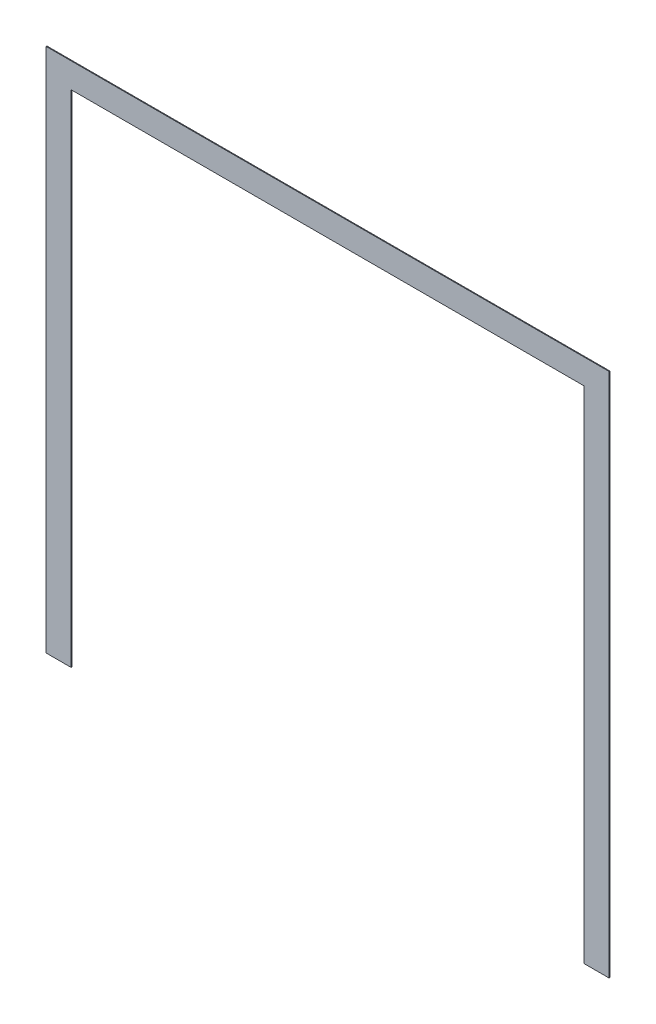
ISO-10303-21;
HEADER;
FILE_DESCRIPTION(('STEP AP214'),'2;1');
FILE_NAME('part.step','',(''),(''),'','','');
FILE_SCHEMA(('AUTOMOTIVE_DESIGN { 1 0 10303 214 1 1 1 1 }'));
ENDSEC;
DATA;
#1=APPLICATION_CONTEXT('core data for automotive mechanical design processes');
#2=APPLICATION_PROTOCOL_DEFINITION('international standard','automotive_design',2000,#1);
#3=PRODUCT_CONTEXT('',#1,'mechanical');
#4=PRODUCT('Part','Part','',(#3));
#5=PRODUCT_RELATED_PRODUCT_CATEGORY('part','',(#4));
#6=PRODUCT_DEFINITION_FORMATION('','',#4);
#7=PRODUCT_DEFINITION_CONTEXT('part definition',#1,'design');
#8=PRODUCT_DEFINITION('design','',#6,#7);
#9=PRODUCT_DEFINITION_SHAPE('','',#8);
#10=(LENGTH_UNIT() NAMED_UNIT(*) SI_UNIT(.MILLI.,.METRE.));
#11=(NAMED_UNIT(*) PLANE_ANGLE_UNIT() SI_UNIT($,.RADIAN.));
#12=(NAMED_UNIT(*) SI_UNIT($,.STERADIAN.) SOLID_ANGLE_UNIT());
#13=UNCERTAINTY_MEASURE_WITH_UNIT(LENGTH_MEASURE(1.E-05),#10,'distance_accuracy_value','');
#14=(GEOMETRIC_REPRESENTATION_CONTEXT(3) GLOBAL_UNCERTAINTY_ASSIGNED_CONTEXT((#13)) GLOBAL_UNIT_ASSIGNED_CONTEXT((#10,
#11,#12)) REPRESENTATION_CONTEXT('',''));
#15=CARTESIAN_POINT('',(0.,0.,0.));
#16=DIRECTION('',(0.,0.,1.));
#17=DIRECTION('',(1.,0.,0.));
#18=AXIS2_PLACEMENT_3D('',#15,#16,#17);
#19=CARTESIAN_POINT('',(386.733357334136,-2891.73158988954,1.5875));
#20=DIRECTION('',(0.,0.,1.));
#21=DIRECTION('',(1.,0.,0.));
#22=AXIS2_PLACEMENT_3D('',#19,#20,#21);
#23=PLANE('',#22);
#24=DIRECTION('',(0.,-1.,0.));
#25=VECTOR('',#24,1.);
#26=CARTESIAN_POINT('',(907.433357334139,-2917.13158988954,1.5875));
#27=LINE('',#26,#25);
#28=CARTESIAN_POINT('',(907.433357334139,-3425.13158988954,1.5875));
#29=VERTEX_POINT('',#28);
#30=CARTESIAN_POINT('',(907.433357334139,-2409.13158988953,1.5875));
#31=VERTEX_POINT('',#30);
#32=EDGE_CURVE('E110',#29,#31,#27,.F.);
#33=ORIENTED_EDGE('',*,*,#32,.F.);
#34=DIRECTION('',(1.,0.,0.));
#35=VECTOR('',#34,1.);
#36=CARTESIAN_POINT('',(932.833357334139,-3425.13158988954,1.5875));
#37=LINE('',#36,#35);
#38=CARTESIAN_POINT('',(958.233357334139,-3425.13158988954,1.5875));
#39=VERTEX_POINT('',#38);
#40=EDGE_CURVE('E114',#39,#29,#37,.F.);
#41=ORIENTED_EDGE('',*,*,#40,.F.);
#42=DIRECTION('',(0.,1.,0.));
#43=VECTOR('',#42,1.);
#44=CARTESIAN_POINT('',(958.233357334139,-2891.73158988954,1.5875));
#45=LINE('',#44,#43);
#46=CARTESIAN_POINT('',(958.233357334139,-2358.33158988953,1.5875));
#47=VERTEX_POINT('',#46);
#48=EDGE_CURVE('E118',#47,#39,#45,.F.);
#49=ORIENTED_EDGE('',*,*,#48,.F.);
#50=DIRECTION('',(1.,0.,0.));
#51=VECTOR('',#50,1.);
#52=CARTESIAN_POINT('',(386.733357334136,-2358.33158988953,1.5875));
#53=LINE('',#52,#51);
#54=CARTESIAN_POINT('',(-184.766642665863,-2358.33158988953,1.5875));
#55=VERTEX_POINT('',#54);
#56=EDGE_CURVE('E95',#55,#47,#53,.T.);
#57=ORIENTED_EDGE('',*,*,#56,.F.);
#58=DIRECTION('',(0.,1.,0.));
#59=VECTOR('',#58,1.);
#60=CARTESIAN_POINT('',(-184.766642665863,-2891.73158988954,1.5875));
#61=LINE('',#60,#59);
#62=CARTESIAN_POINT('',(-184.766642665863,-3425.13158988954,1.5875));
#63=VERTEX_POINT('',#62);
#64=EDGE_CURVE('E20',#63,#55,#61,.T.);
#65=ORIENTED_EDGE('',*,*,#64,.F.);
#66=DIRECTION('',(1.,0.,0.));
#67=VECTOR('',#66,1.);
#68=CARTESIAN_POINT('',(-159.366642665863,-3425.13158988954,1.5875));
#69=LINE('',#68,#67);
#70=CARTESIAN_POINT('',(-133.966642665863,-3425.13158988954,1.5875));
#71=VERTEX_POINT('',#70);
#72=EDGE_CURVE('E83',#71,#63,#69,.F.);
#73=ORIENTED_EDGE('',*,*,#72,.F.);
#74=DIRECTION('',(0.,1.,0.));
#75=VECTOR('',#74,1.);
#76=CARTESIAN_POINT('',(-133.966642665863,-2917.13158988954,1.5875));
#77=LINE('',#76,#75);
#78=CARTESIAN_POINT('',(-133.966642665863,-2409.13158988953,1.5875));
#79=VERTEX_POINT('',#78);
#80=EDGE_CURVE('E78',#79,#71,#77,.F.);
#81=ORIENTED_EDGE('',*,*,#80,.F.);
#82=DIRECTION('',(1.,0.,0.));
#83=VECTOR('',#82,1.);
#84=CARTESIAN_POINT('',(386.733357334136,-2409.13158988953,1.5875));
#85=LINE('',#84,#83);
#86=EDGE_CURVE('E106',#31,#79,#85,.F.);
#87=ORIENTED_EDGE('',*,*,#86,.F.);
#88=EDGE_LOOP('',(#33,#41,#49,#57,#65,#73,#81,#87));
#89=FACE_BOUND('',#88,.T.);
#90=ADVANCED_FACE('F17',(#89),#23,.T.);
#91=CARTESIAN_POINT('',(-184.766642665863,-2891.73158988954,3.175));
#92=DIRECTION('',(-1.,0.,0.));
#93=DIRECTION('',(0.,0.,1.));
#94=AXIS2_PLACEMENT_3D('',#91,#92,#93);
#95=PLANE('',#94);
#96=DIRECTION('',(0.,1.,0.));
#97=VECTOR('',#96,1.);
#98=CARTESIAN_POINT('',(-184.766642665863,-2891.73158988954,0.));
#99=LINE('',#98,#97);
#100=CARTESIAN_POINT('',(-184.766642665863,-2358.33158988953,0.));
#101=VERTEX_POINT('',#100);
#102=CARTESIAN_POINT('',(-184.766642665863,-3425.13158988954,0.));
#103=VERTEX_POINT('',#102);
#104=EDGE_CURVE('E101',#101,#103,#99,.F.);
#105=ORIENTED_EDGE('',*,*,#104,.T.);
#106=DIRECTION('',(0.,0.,-1.));
#107=VECTOR('',#106,1.);
#108=CARTESIAN_POINT('',(-184.766642665863,-3425.13158988954,3.175));
#109=LINE('',#108,#107);
#110=EDGE_CURVE('E88',#63,#103,#109,.T.);
#111=ORIENTED_EDGE('',*,*,#110,.F.);
#112=ORIENTED_EDGE('',*,*,#64,.T.);
#113=DIRECTION('',(0.,0.,1.));
#114=VECTOR('',#113,1.);
#115=CARTESIAN_POINT('',(-184.766642665863,-2358.33158988953,3.175));
#116=LINE('',#115,#114);
#117=EDGE_CURVE('E124',#101,#55,#116,.T.);
#118=ORIENTED_EDGE('',*,*,#117,.F.);
#119=EDGE_LOOP('',(#105,#111,#112,#118));
#120=FACE_BOUND('',#119,.T.);
#121=ADVANCED_FACE('F100',(#120),#95,.T.);
#122=CARTESIAN_POINT('',(-159.366642665863,-3425.13158988954,3.175));
#123=DIRECTION('',(0.,-1.,0.));
#124=DIRECTION('',(0.,0.,-1.));
#125=AXIS2_PLACEMENT_3D('',#122,#123,#124);
#126=PLANE('',#125);
#127=DIRECTION('',(1.,0.,0.));
#128=VECTOR('',#127,1.);
#129=CARTESIAN_POINT('',(386.733357334136,-3425.13158988954,0.));
#130=LINE('',#129,#128);
#131=CARTESIAN_POINT('',(-133.966642665863,-3425.13158988954,0.));
#132=VERTEX_POINT('',#131);
#133=EDGE_CURVE('E127',#103,#132,#130,.T.);
#134=ORIENTED_EDGE('',*,*,#133,.T.);
#135=DIRECTION('',(0.,0.,1.));
#136=VECTOR('',#135,1.);
#137=CARTESIAN_POINT('',(-133.966642665863,-3425.13158988954,3.175));
#138=LINE('',#137,#136);
#139=EDGE_CURVE('E90',#71,#132,#138,.F.);
#140=ORIENTED_EDGE('',*,*,#139,.F.);
#141=ORIENTED_EDGE('',*,*,#72,.T.);
#142=ORIENTED_EDGE('',*,*,#110,.T.);
#143=EDGE_LOOP('',(#134,#140,#141,#142));
#144=FACE_BOUND('',#143,.T.);
#145=ADVANCED_FACE('F86',(#144),#126,.T.);
#146=CARTESIAN_POINT('',(-133.966642665863,-2917.13158988954,3.175));
#147=DIRECTION('',(1.,0.,0.));
#148=DIRECTION('',(0.,1.,0.));
#149=AXIS2_PLACEMENT_3D('',#146,#147,#148);
#150=PLANE('',#149);
#151=DIRECTION('',(0.,1.,0.));
#152=VECTOR('',#151,1.);
#153=CARTESIAN_POINT('',(-133.966642665863,-2891.73158988954,0.));
#154=LINE('',#153,#152);
#155=CARTESIAN_POINT('',(-133.966642665863,-2409.13158988953,0.));
#156=VERTEX_POINT('',#155);
#157=EDGE_CURVE('E129',#132,#156,#154,.T.);
#158=ORIENTED_EDGE('',*,*,#157,.T.);
#159=DIRECTION('',(0.,0.,-1.));
#160=VECTOR('',#159,1.);
#161=CARTESIAN_POINT('',(-133.966642665863,-2409.13158988953,3.175));
#162=LINE('',#161,#160);
#163=EDGE_CURVE('E108',#79,#156,#162,.T.);
#164=ORIENTED_EDGE('',*,*,#163,.F.);
#165=ORIENTED_EDGE('',*,*,#80,.T.);
#166=ORIENTED_EDGE('',*,*,#139,.T.);
#167=EDGE_LOOP('',(#158,#164,#165,#166));
#168=FACE_BOUND('',#167,.T.);
#169=ADVANCED_FACE('F162',(#168),#150,.T.);
#170=CARTESIAN_POINT('',(386.733357334136,-2409.13158988953,3.175));
#171=DIRECTION('',(0.,-1.,0.));
#172=DIRECTION('',(0.,0.,-1.));
#173=AXIS2_PLACEMENT_3D('',#170,#171,#172);
#174=PLANE('',#173);
#175=DIRECTION('',(1.,0.,0.));
#176=VECTOR('',#175,1.);
#177=CARTESIAN_POINT('',(386.733357334136,-2409.13158988953,0.));
#178=LINE('',#177,#176);
#179=CARTESIAN_POINT('',(907.433357334139,-2409.13158988953,0.));
#180=VERTEX_POINT('',#179);
#181=EDGE_CURVE('E132',#156,#180,#178,.T.);
#182=ORIENTED_EDGE('',*,*,#181,.T.);
#183=DIRECTION('',(0.,0.,1.));
#184=VECTOR('',#183,1.);
#185=CARTESIAN_POINT('',(907.433357334139,-2409.13158988953,3.175));
#186=LINE('',#185,#184);
#187=EDGE_CURVE('E112',#31,#180,#186,.F.);
#188=ORIENTED_EDGE('',*,*,#187,.F.);
#189=ORIENTED_EDGE('',*,*,#86,.T.);
#190=ORIENTED_EDGE('',*,*,#163,.T.);
#191=EDGE_LOOP('',(#182,#188,#189,#190));
#192=FACE_BOUND('',#191,.T.);
#193=ADVANCED_FACE('F161',(#192),#174,.T.);
#194=CARTESIAN_POINT('',(907.433357334139,-2917.13158988954,3.175));
#195=DIRECTION('',(-1.,0.,0.));
#196=DIRECTION('',(0.,-1.,0.));
#197=AXIS2_PLACEMENT_3D('',#194,#195,#196);
#198=PLANE('',#197);
#199=DIRECTION('',(0.,1.,0.));
#200=VECTOR('',#199,1.);
#201=CARTESIAN_POINT('',(907.433357334139,-2891.73158988954,0.));
#202=LINE('',#201,#200);
#203=CARTESIAN_POINT('',(907.433357334139,-3425.13158988954,0.));
#204=VERTEX_POINT('',#203);
#205=EDGE_CURVE('E135',#180,#204,#202,.F.);
#206=ORIENTED_EDGE('',*,*,#205,.T.);
#207=DIRECTION('',(0.,0.,-1.));
#208=VECTOR('',#207,1.);
#209=CARTESIAN_POINT('',(907.433357334139,-3425.13158988954,3.175));
#210=LINE('',#209,#208);
#211=EDGE_CURVE('E116',#29,#204,#210,.T.);
#212=ORIENTED_EDGE('',*,*,#211,.F.);
#213=ORIENTED_EDGE('',*,*,#32,.T.);
#214=ORIENTED_EDGE('',*,*,#187,.T.);
#215=EDGE_LOOP('',(#206,#212,#213,#214));
#216=FACE_BOUND('',#215,.T.);
#217=ADVANCED_FACE('F155',(#216),#198,.T.);
#218=CARTESIAN_POINT('',(932.833357334139,-3425.13158988954,3.175));
#219=DIRECTION('',(0.,-1.,0.));
#220=DIRECTION('',(0.,0.,-1.));
#221=AXIS2_PLACEMENT_3D('',#218,#219,#220);
#222=PLANE('',#221);
#223=DIRECTION('',(1.,0.,0.));
#224=VECTOR('',#223,1.);
#225=CARTESIAN_POINT('',(386.733357334136,-3425.13158988954,0.));
#226=LINE('',#225,#224);
#227=CARTESIAN_POINT('',(958.233357334139,-3425.13158988954,0.));
#228=VERTEX_POINT('',#227);
#229=EDGE_CURVE('E138',#204,#228,#226,.T.);
#230=ORIENTED_EDGE('',*,*,#229,.T.);
#231=DIRECTION('',(0.,0.,1.));
#232=VECTOR('',#231,1.);
#233=CARTESIAN_POINT('',(958.233357334139,-3425.13158988954,3.175));
#234=LINE('',#233,#232);
#235=EDGE_CURVE('E120',#39,#228,#234,.F.);
#236=ORIENTED_EDGE('',*,*,#235,.F.);
#237=ORIENTED_EDGE('',*,*,#40,.T.);
#238=ORIENTED_EDGE('',*,*,#211,.T.);
#239=EDGE_LOOP('',(#230,#236,#237,#238));
#240=FACE_BOUND('',#239,.T.);
#241=ADVANCED_FACE('F151',(#240),#222,.T.);
#242=CARTESIAN_POINT('',(958.233357334139,-2891.73158988954,3.175));
#243=DIRECTION('',(1.,0.,0.));
#244=DIRECTION('',(0.,1.,0.));
#245=AXIS2_PLACEMENT_3D('',#242,#243,#244);
#246=PLANE('',#245);
#247=DIRECTION('',(0.,1.,0.));
#248=VECTOR('',#247,1.);
#249=CARTESIAN_POINT('',(958.233357334139,-2891.73158988954,0.));
#250=LINE('',#249,#248);
#251=CARTESIAN_POINT('',(958.233357334139,-2358.33158988953,0.));
#252=VERTEX_POINT('',#251);
#253=EDGE_CURVE('E26',#228,#252,#250,.T.);
#254=ORIENTED_EDGE('',*,*,#253,.T.);
#255=DIRECTION('',(0.,0.,1.));
#256=VECTOR('',#255,1.);
#257=CARTESIAN_POINT('',(958.233357334139,-2358.33158988953,3.175));
#258=LINE('',#257,#256);
#259=EDGE_CURVE('E34',#47,#252,#258,.F.);
#260=ORIENTED_EDGE('',*,*,#259,.F.);
#261=ORIENTED_EDGE('',*,*,#48,.T.);
#262=ORIENTED_EDGE('',*,*,#235,.T.);
#263=EDGE_LOOP('',(#254,#260,#261,#262));
#264=FACE_BOUND('',#263,.T.);
#265=ADVANCED_FACE('F144',(#264),#246,.T.);
#266=CARTESIAN_POINT('',(386.733357334136,-2358.33158988953,3.175));
#267=DIRECTION('',(0.,1.,0.));
#268=DIRECTION('',(0.,0.,1.));
#269=AXIS2_PLACEMENT_3D('',#266,#267,#268);
#270=PLANE('',#269);
#271=DIRECTION('',(1.,0.,0.));
#272=VECTOR('',#271,1.);
#273=CARTESIAN_POINT('',(386.733357334136,-2358.33158988953,0.));
#274=LINE('',#273,#272);
#275=EDGE_CURVE('E11',#252,#101,#274,.F.);
#276=ORIENTED_EDGE('',*,*,#275,.T.);
#277=ORIENTED_EDGE('',*,*,#117,.T.);
#278=ORIENTED_EDGE('',*,*,#56,.T.);
#279=ORIENTED_EDGE('',*,*,#259,.T.);
#280=EDGE_LOOP('',(#276,#277,#278,#279));
#281=FACE_BOUND('',#280,.T.);
#282=ADVANCED_FACE('F163',(#281),#270,.T.);
#283=CARTESIAN_POINT('',(386.733357334136,-2891.73158988954,0.));
#284=DIRECTION('',(0.,0.,1.));
#285=DIRECTION('',(1.,0.,0.));
#286=AXIS2_PLACEMENT_3D('',#283,#284,#285);
#287=PLANE('',#286);
#288=ORIENTED_EDGE('',*,*,#253,.F.);
#289=ORIENTED_EDGE('',*,*,#229,.F.);
#290=ORIENTED_EDGE('',*,*,#205,.F.);
#291=ORIENTED_EDGE('',*,*,#181,.F.);
#292=ORIENTED_EDGE('',*,*,#157,.F.);
#293=ORIENTED_EDGE('',*,*,#133,.F.);
#294=ORIENTED_EDGE('',*,*,#104,.F.);
#295=ORIENTED_EDGE('',*,*,#275,.F.);
#296=EDGE_LOOP('',(#288,#289,#290,#291,#292,#293,#294,#295));
#297=FACE_BOUND('',#296,.T.);
#298=ADVANCED_FACE('F148',(#297),#287,.F.);
#299=CLOSED_SHELL('',(#90,#121,#145,#169,#193,#217,#241,#265,#282,#298));
#300=MANIFOLD_SOLID_BREP('B1',#299);
#301=ADVANCED_BREP_SHAPE_REPRESENTATION('',(#18,#300),#14);
#302=SHAPE_DEFINITION_REPRESENTATION(#9,#301);
ENDSEC;
END-ISO-10303-21;
